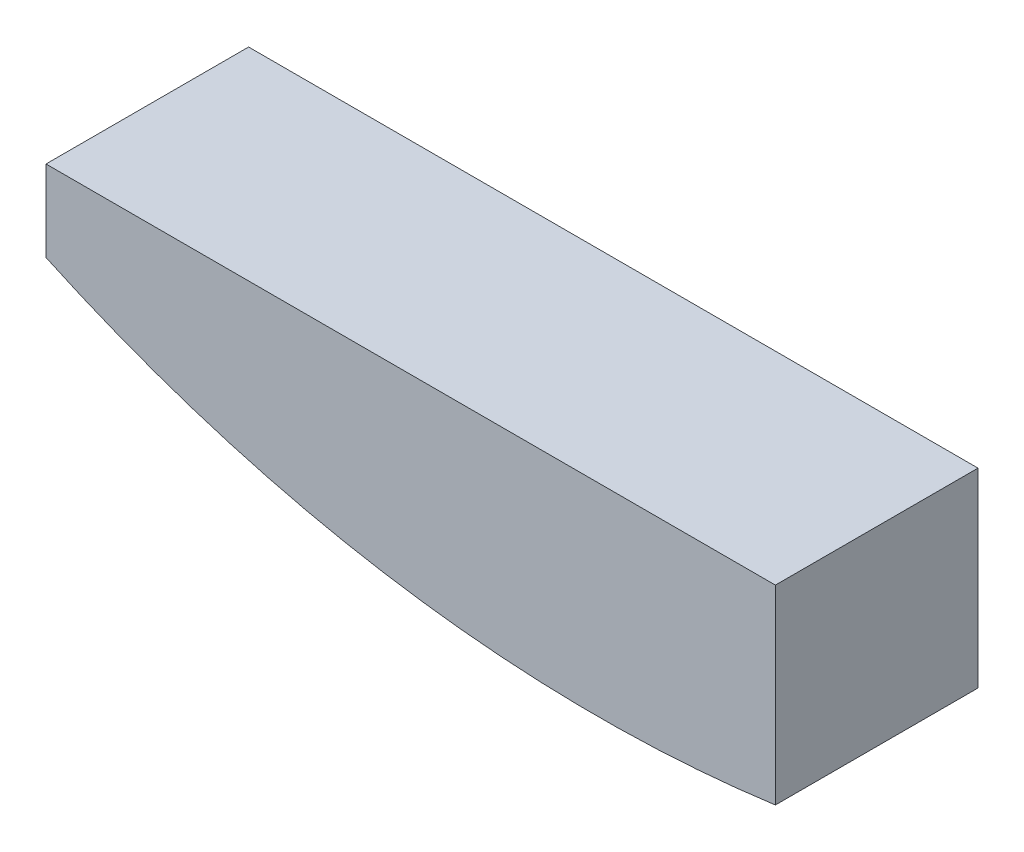
ISO-10303-21;
HEADER;
FILE_DESCRIPTION(('STEP AP214'),'2;1');
FILE_NAME('part.step','',(''),(''),'','','');
FILE_SCHEMA(('AUTOMOTIVE_DESIGN { 1 0 10303 214 1 1 1 1 }'));
ENDSEC;
DATA;
#1=APPLICATION_CONTEXT('core data for automotive mechanical design processes');
#2=APPLICATION_PROTOCOL_DEFINITION('international standard','automotive_design',2000,#1);
#3=PRODUCT_CONTEXT('',#1,'mechanical');
#4=PRODUCT('Part','Part','',(#3));
#5=PRODUCT_RELATED_PRODUCT_CATEGORY('part','',(#4));
#6=PRODUCT_DEFINITION_FORMATION('','',#4);
#7=PRODUCT_DEFINITION_CONTEXT('part definition',#1,'design');
#8=PRODUCT_DEFINITION('design','',#6,#7);
#9=PRODUCT_DEFINITION_SHAPE('','',#8);
#10=(LENGTH_UNIT() NAMED_UNIT(*) SI_UNIT(.MILLI.,.METRE.));
#11=(NAMED_UNIT(*) PLANE_ANGLE_UNIT() SI_UNIT($,.RADIAN.));
#12=(NAMED_UNIT(*) SI_UNIT($,.STERADIAN.) SOLID_ANGLE_UNIT());
#13=UNCERTAINTY_MEASURE_WITH_UNIT(LENGTH_MEASURE(1.E-05),#10,'distance_accuracy_value','');
#14=(GEOMETRIC_REPRESENTATION_CONTEXT(3) GLOBAL_UNCERTAINTY_ASSIGNED_CONTEXT((#13)) GLOBAL_UNIT_ASSIGNED_CONTEXT((#10,
#11,#12)) REPRESENTATION_CONTEXT('',''));
#15=CARTESIAN_POINT('',(0.,0.,0.));
#16=DIRECTION('',(0.,0.,1.));
#17=DIRECTION('',(1.,0.,0.));
#18=AXIS2_PLACEMENT_3D('',#15,#16,#17);
#19=CARTESIAN_POINT('',(0.,5.,0.));
#20=DIRECTION('',(0.,0.,-1.));
#21=DIRECTION('',(-1.,0.,0.));
#22=AXIS2_PLACEMENT_3D('',#19,#20,#21);
#23=PLANE('',#22);
#24=DIRECTION('',(0.,-1.,0.));
#25=VECTOR('',#24,1.);
#26=CARTESIAN_POINT('',(18.,5.,0.));
#27=LINE('',#26,#25);
#28=CARTESIAN_POINT('',(18.,7.,0.));
#29=VERTEX_POINT('',#28);
#30=CARTESIAN_POINT('',(18.,2.3,0.));
#31=VERTEX_POINT('',#30);
#32=EDGE_CURVE('E11',#29,#31,#27,.T.);
#33=ORIENTED_EDGE('',*,*,#32,.F.);
#34=DIRECTION('',(1.,0.,0.));
#35=VECTOR('',#34,1.);
#36=CARTESIAN_POINT('',(0.,7.,0.));
#37=LINE('',#36,#35);
#38=CARTESIAN_POINT('',(0.,7.,0.));
#39=VERTEX_POINT('',#38);
#40=EDGE_CURVE('E88',#39,#29,#37,.T.);
#41=ORIENTED_EDGE('',*,*,#40,.F.);
#42=DIRECTION('',(0.,-1.,0.));
#43=VECTOR('',#42,1.);
#44=CARTESIAN_POINT('',(0.,7.,0.));
#45=LINE('',#44,#43);
#46=CARTESIAN_POINT('',(0.,5.,0.));
#47=VERTEX_POINT('',#46);
#48=EDGE_CURVE('E83',#39,#47,#45,.T.);
#49=ORIENTED_EDGE('',*,*,#48,.T.);
#50=CARTESIAN_POINT('',(13.6046892178722,34.347928119148,0.));
#51=DIRECTION('',(0.,0.,-1.));
#52=DIRECTION('',(1.,0.,0.));
#53=AXIS2_PLACEMENT_3D('',#50,#51,#52);
#54=CIRCLE('',#53,32.347928119148);
#55=EDGE_CURVE('E102',#31,#47,#54,.T.);
#56=ORIENTED_EDGE('',*,*,#55,.F.);
#57=EDGE_LOOP('',(#33,#41,#49,#56));
#58=FACE_BOUND('',#57,.T.);
#59=ADVANCED_FACE('F39',(#58),#23,.F.);
#60=CARTESIAN_POINT('',(18.,5.,0.));
#61=DIRECTION('',(-1.,0.,0.));
#62=DIRECTION('',(0.,0.,1.));
#63=AXIS2_PLACEMENT_3D('',#60,#61,#62);
#64=PLANE('',#63);
#65=ORIENTED_EDGE('',*,*,#32,.T.);
#66=DIRECTION('',(0.,0.,1.));
#67=VECTOR('',#66,1.);
#68=CARTESIAN_POINT('',(18.,2.3,-5.));
#69=LINE('',#68,#67);
#70=CARTESIAN_POINT('',(18.,2.3,-5.));
#71=VERTEX_POINT('',#70);
#72=EDGE_CURVE('E111',#71,#31,#69,.T.);
#73=ORIENTED_EDGE('',*,*,#72,.F.);
#74=DIRECTION('',(0.,-1.,0.));
#75=VECTOR('',#74,1.);
#76=CARTESIAN_POINT('',(18.,5.,-5.));
#77=LINE('',#76,#75);
#78=CARTESIAN_POINT('',(18.,7.,-5.));
#79=VERTEX_POINT('',#78);
#80=EDGE_CURVE('E48',#79,#71,#77,.T.);
#81=ORIENTED_EDGE('',*,*,#80,.F.);
#82=DIRECTION('',(0.,0.,-1.));
#83=VECTOR('',#82,1.);
#84=CARTESIAN_POINT('',(18.,7.,0.));
#85=LINE('',#84,#83);
#86=EDGE_CURVE('E95',#29,#79,#85,.T.);
#87=ORIENTED_EDGE('',*,*,#86,.F.);
#88=EDGE_LOOP('',(#65,#73,#81,#87));
#89=FACE_BOUND('',#88,.T.);
#90=ADVANCED_FACE('F119',(#89),#64,.F.);
#91=CARTESIAN_POINT('',(0.,5.,-5.));
#92=DIRECTION('',(0.,0.,1.));
#93=DIRECTION('',(1.,0.,0.));
#94=AXIS2_PLACEMENT_3D('',#91,#92,#93);
#95=PLANE('',#94);
#96=ORIENTED_EDGE('',*,*,#80,.T.);
#97=CARTESIAN_POINT('',(13.6046892178722,34.347928119148,-5.));
#98=DIRECTION('',(0.,0.,-1.));
#99=DIRECTION('',(1.,0.,0.));
#100=AXIS2_PLACEMENT_3D('',#97,#98,#99);
#101=CIRCLE('',#100,32.347928119148);
#102=CARTESIAN_POINT('',(0.,5.,-5.));
#103=VERTEX_POINT('',#102);
#104=EDGE_CURVE('E55',#71,#103,#101,.T.);
#105=ORIENTED_EDGE('',*,*,#104,.T.);
#106=DIRECTION('',(0.,-1.,0.));
#107=VECTOR('',#106,1.);
#108=CARTESIAN_POINT('',(0.,7.,-5.));
#109=LINE('',#108,#107);
#110=CARTESIAN_POINT('',(0.,7.,-5.));
#111=VERTEX_POINT('',#110);
#112=EDGE_CURVE('E81',#111,#103,#109,.T.);
#113=ORIENTED_EDGE('',*,*,#112,.F.);
#114=DIRECTION('',(-1.,0.,0.));
#115=VECTOR('',#114,1.);
#116=CARTESIAN_POINT('',(18.,7.,-5.));
#117=LINE('',#116,#115);
#118=EDGE_CURVE('E89',#79,#111,#117,.T.);
#119=ORIENTED_EDGE('',*,*,#118,.F.);
#120=EDGE_LOOP('',(#96,#105,#113,#119));
#121=FACE_BOUND('',#120,.T.);
#122=ADVANCED_FACE('F100',(#121),#95,.F.);
#123=CARTESIAN_POINT('',(13.6046892178722,34.347928119148,-5.));
#124=DIRECTION('',(0.,0.,1.));
#125=DIRECTION('',(1.,0.,0.));
#126=AXIS2_PLACEMENT_3D('',#123,#124,#125);
#127=CYLINDRICAL_SURFACE('',#126,32.347928119148);
#128=ORIENTED_EDGE('',*,*,#55,.T.);
#129=DIRECTION('',(0.,0.,1.));
#130=VECTOR('',#129,1.);
#131=CARTESIAN_POINT('',(0.,5.,0.));
#132=LINE('',#131,#130);
#133=EDGE_CURVE('E115',#103,#47,#132,.T.);
#134=ORIENTED_EDGE('',*,*,#133,.F.);
#135=ORIENTED_EDGE('',*,*,#104,.F.);
#136=ORIENTED_EDGE('',*,*,#72,.T.);
#137=EDGE_LOOP('',(#128,#134,#135,#136));
#138=FACE_BOUND('',#137,.T.);
#139=ADVANCED_FACE('F121',(#138),#127,.T.);
#140=CARTESIAN_POINT('',(0.,7.,-5.));
#141=DIRECTION('',(1.,0.,0.));
#142=DIRECTION('',(0.,0.,-1.));
#143=AXIS2_PLACEMENT_3D('',#140,#141,#142);
#144=PLANE('',#143);
#145=ORIENTED_EDGE('',*,*,#133,.T.);
#146=ORIENTED_EDGE('',*,*,#48,.F.);
#147=DIRECTION('',(0.,0.,1.));
#148=VECTOR('',#147,1.);
#149=CARTESIAN_POINT('',(0.,7.,-5.));
#150=LINE('',#149,#148);
#151=EDGE_CURVE('E76',#111,#39,#150,.T.);
#152=ORIENTED_EDGE('',*,*,#151,.F.);
#153=ORIENTED_EDGE('',*,*,#112,.T.);
#154=EDGE_LOOP('',(#145,#146,#152,#153));
#155=FACE_BOUND('',#154,.T.);
#156=ADVANCED_FACE('F79',(#155),#144,.F.);
#157=CARTESIAN_POINT('',(0.,7.,0.));
#158=DIRECTION('',(0.,1.,0.));
#159=DIRECTION('',(0.,0.,1.));
#160=AXIS2_PLACEMENT_3D('',#157,#158,#159);
#161=PLANE('',#160);
#162=ORIENTED_EDGE('',*,*,#118,.T.);
#163=ORIENTED_EDGE('',*,*,#151,.T.);
#164=ORIENTED_EDGE('',*,*,#40,.T.);
#165=ORIENTED_EDGE('',*,*,#86,.T.);
#166=EDGE_LOOP('',(#162,#163,#164,#165));
#167=FACE_BOUND('',#166,.T.);
#168=ADVANCED_FACE('F93',(#167),#161,.T.);
#169=CLOSED_SHELL('',(#59,#90,#122,#139,#156,#168));
#170=MANIFOLD_SOLID_BREP('B2',#169);
#171=ADVANCED_BREP_SHAPE_REPRESENTATION('',(#18,#170),#14);
#172=SHAPE_DEFINITION_REPRESENTATION(#9,#171);
ENDSEC;
END-ISO-10303-21;
